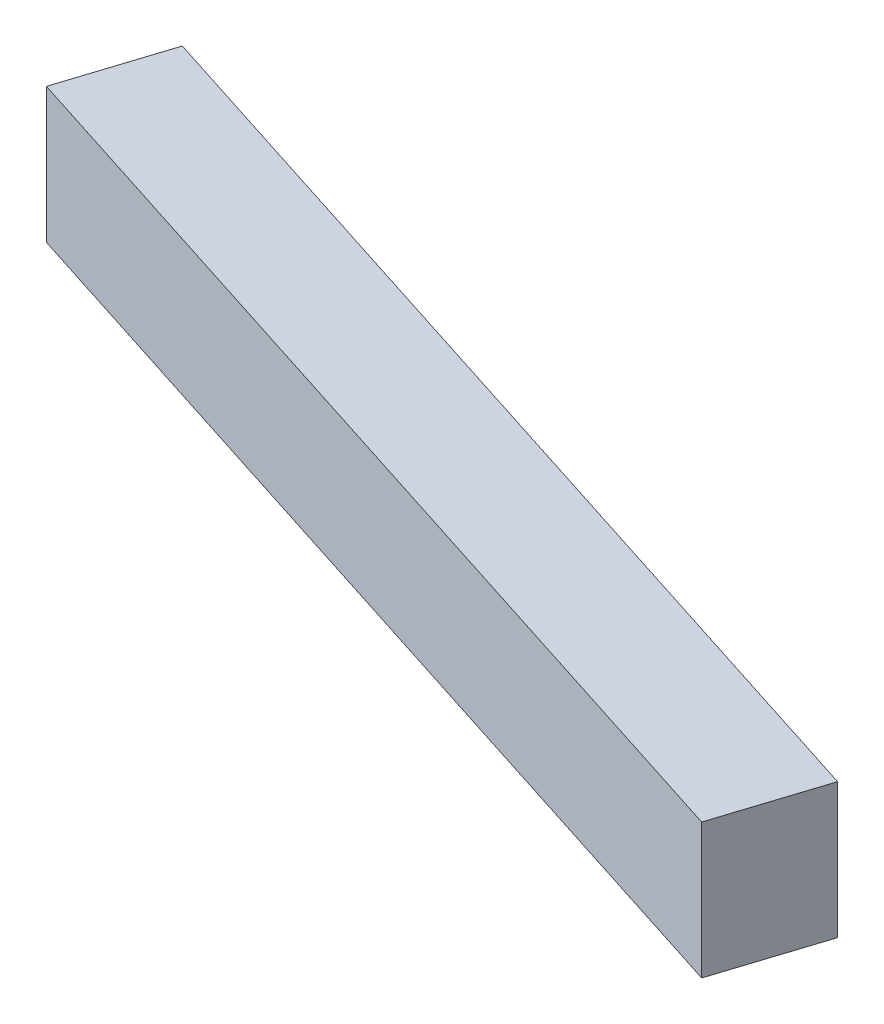
ISO-10303-21;
HEADER;
FILE_DESCRIPTION(('STEP AP214'),'2;1');
FILE_NAME('part.step','',(''),(''),'','','');
FILE_SCHEMA(('AUTOMOTIVE_DESIGN { 1 0 10303 214 1 1 1 1 }'));
ENDSEC;
DATA;
#1=APPLICATION_CONTEXT('core data for automotive mechanical design processes');
#2=APPLICATION_PROTOCOL_DEFINITION('international standard','automotive_design',2000,#1);
#3=PRODUCT_CONTEXT('',#1,'mechanical');
#4=PRODUCT('Part','Part','',(#3));
#5=PRODUCT_RELATED_PRODUCT_CATEGORY('part','',(#4));
#6=PRODUCT_DEFINITION_FORMATION('','',#4);
#7=PRODUCT_DEFINITION_CONTEXT('part definition',#1,'design');
#8=PRODUCT_DEFINITION('design','',#6,#7);
#9=PRODUCT_DEFINITION_SHAPE('','',#8);
#10=(LENGTH_UNIT() NAMED_UNIT(*) SI_UNIT(.MILLI.,.METRE.));
#11=(NAMED_UNIT(*) PLANE_ANGLE_UNIT() SI_UNIT($,.RADIAN.));
#12=(NAMED_UNIT(*) SI_UNIT($,.STERADIAN.) SOLID_ANGLE_UNIT());
#13=UNCERTAINTY_MEASURE_WITH_UNIT(LENGTH_MEASURE(1.E-05),#10,'distance_accuracy_value','');
#14=(GEOMETRIC_REPRESENTATION_CONTEXT(3) GLOBAL_UNCERTAINTY_ASSIGNED_CONTEXT((#13)) GLOBAL_UNIT_ASSIGNED_CONTEXT((#10,
#11,#12)) REPRESENTATION_CONTEXT('',''));
#15=CARTESIAN_POINT('',(0.,0.,0.));
#16=DIRECTION('',(0.,0.,1.));
#17=DIRECTION('',(1.,0.,0.));
#18=AXIS2_PLACEMENT_3D('',#15,#16,#17);
#19=CARTESIAN_POINT('',(17.168647709003,7.874,5.40152490521152));
#20=DIRECTION('',(-0.305451567320852,0.,0.952207613927359));
#21=DIRECTION('',(0.952207613927359,0.,0.305451567320852));
#22=AXIS2_PLACEMENT_3D('',#19,#20,#21);
#23=PLANE('',#22);
#24=DIRECTION('',(0.,1.,0.));
#25=VECTOR('',#24,1.);
#26=CARTESIAN_POINT('',(17.168647709003,7.874,5.40152490521152));
#27=LINE('',#26,#25);
#28=CARTESIAN_POINT('',(17.168647709003,7.62,5.40152490521152));
#29=VERTEX_POINT('',#28);
#30=CARTESIAN_POINT('',(17.168647709003,7.874,5.40152490521152));
#31=VERTEX_POINT('',#30);
#32=EDGE_CURVE('E20',#29,#31,#27,.T.);
#33=ORIENTED_EDGE('',*,*,#32,.T.);
#34=DIRECTION('',(0.952207613927359,0.,0.305451567320854));
#35=VECTOR('',#34,1.);
#36=CARTESIAN_POINT('',(17.168647709003,7.874,5.40152490521152));
#37=LINE('',#36,#35);
#38=CARTESIAN_POINT('',(18.9826032135346,7.874,5.98341014095774));
#39=VERTEX_POINT('',#38);
#40=EDGE_CURVE('E55',#31,#39,#37,.T.);
#41=ORIENTED_EDGE('',*,*,#40,.T.);
#42=DIRECTION('',(0.,1.,0.));
#43=VECTOR('',#42,1.);
#44=CARTESIAN_POINT('',(18.9826032135346,7.874,5.98341014095774));
#45=LINE('',#44,#43);
#46=CARTESIAN_POINT('',(18.9826032135346,7.62,5.98341014095774));
#47=VERTEX_POINT('',#46);
#48=EDGE_CURVE('E76',#39,#47,#45,.F.);
#49=ORIENTED_EDGE('',*,*,#48,.T.);
#50=DIRECTION('',(0.952207613927359,0.,0.305451567320854));
#51=VECTOR('',#50,1.);
#52=CARTESIAN_POINT('',(17.168647709003,7.62,5.40152490521152));
#53=LINE('',#52,#51);
#54=EDGE_CURVE('E58',#29,#47,#53,.T.);
#55=ORIENTED_EDGE('',*,*,#54,.F.);
#56=EDGE_LOOP('',(#33,#41,#49,#55));
#57=FACE_BOUND('',#56,.T.);
#58=ADVANCED_FACE('F17',(#57),#23,.F.);
#59=CARTESIAN_POINT('',(17.168647709003,7.874,5.40152490521152));
#60=DIRECTION('',(0.952207613927382,0.,0.305451567320783));
#61=DIRECTION('',(0.305451567320783,0.,-0.952207613927382));
#62=AXIS2_PLACEMENT_3D('',#59,#60,#61);
#63=PLANE('',#62);
#64=DIRECTION('',(0.,1.,0.));
#65=VECTOR('',#64,1.);
#66=CARTESIAN_POINT('',(17.1065799505234,7.874,5.59501349236157));
#67=LINE('',#66,#65);
#68=CARTESIAN_POINT('',(17.1065799505234,7.62,5.59501349236157));
#69=VERTEX_POINT('',#68);
#70=CARTESIAN_POINT('',(17.1065799505234,7.874,5.59501349236157));
#71=VERTEX_POINT('',#70);
#72=EDGE_CURVE('E73',#69,#71,#67,.T.);
#73=ORIENTED_EDGE('',*,*,#72,.T.);
#74=DIRECTION('',(0.305451567320854,0.,-0.952207613927359));
#75=VECTOR('',#74,1.);
#76=CARTESIAN_POINT('',(17.1065799505234,7.874,5.59501349236157));
#77=LINE('',#76,#75);
#78=EDGE_CURVE('E63',#71,#31,#77,.T.);
#79=ORIENTED_EDGE('',*,*,#78,.T.);
#80=ORIENTED_EDGE('',*,*,#32,.F.);
#81=DIRECTION('',(0.305451567320854,0.,-0.952207613927359));
#82=VECTOR('',#81,1.);
#83=CARTESIAN_POINT('',(17.1065799505234,7.62,5.59501349236157));
#84=LINE('',#83,#82);
#85=EDGE_CURVE('E80',#69,#29,#84,.T.);
#86=ORIENTED_EDGE('',*,*,#85,.F.);
#87=EDGE_LOOP('',(#73,#79,#80,#86));
#88=FACE_BOUND('',#87,.T.);
#89=ADVANCED_FACE('F72',(#88),#63,.F.);
#90=CARTESIAN_POINT('',(17.168647709003,7.874,5.40152490521152));
#91=DIRECTION('',(0.,-1.,0.));
#92=DIRECTION('',(0.,0.,-1.));
#93=AXIS2_PLACEMENT_3D('',#90,#91,#92);
#94=PLANE('',#93);
#95=ORIENTED_EDGE('',*,*,#78,.F.);
#96=DIRECTION('',(-0.95220761392736,0.,-0.305451567320851));
#97=VECTOR('',#96,1.);
#98=CARTESIAN_POINT('',(17.1065799505234,7.874,5.59501349236157));
#99=LINE('',#98,#97);
#100=CARTESIAN_POINT('',(18.9205354553496,7.874,6.17689872820227));
#101=VERTEX_POINT('',#100);
#102=EDGE_CURVE('E83',#71,#101,#99,.F.);
#103=ORIENTED_EDGE('',*,*,#102,.T.);
#104=DIRECTION('',(-0.305451565871283,0.,0.952207614392356));
#105=VECTOR('',#104,1.);
#106=CARTESIAN_POINT('',(18.9826032135346,7.874,5.98341014095774));
#107=LINE('',#106,#105);
#108=EDGE_CURVE('E69',#101,#39,#107,.F.);
#109=ORIENTED_EDGE('',*,*,#108,.T.);
#110=ORIENTED_EDGE('',*,*,#40,.F.);
#111=EDGE_LOOP('',(#95,#103,#109,#110));
#112=FACE_BOUND('',#111,.T.);
#113=ADVANCED_FACE('F66',(#112),#94,.F.);
#114=CARTESIAN_POINT('',(18.9826032135346,7.874,5.98341014095774));
#115=DIRECTION('',(-0.952207614392356,0.,-0.305451565871283));
#116=DIRECTION('',(-0.305451565871283,0.,0.952207614392356));
#117=AXIS2_PLACEMENT_3D('',#114,#115,#116);
#118=PLANE('',#117);
#119=ORIENTED_EDGE('',*,*,#48,.F.);
#120=ORIENTED_EDGE('',*,*,#108,.F.);
#121=DIRECTION('',(0.,1.,0.));
#122=VECTOR('',#121,1.);
#123=CARTESIAN_POINT('',(18.9205354553496,7.874,6.17689872820228));
#124=LINE('',#123,#122);
#125=CARTESIAN_POINT('',(18.9205354553496,7.62,6.17689872820227));
#126=VERTEX_POINT('',#125);
#127=EDGE_CURVE('E26',#101,#126,#124,.F.);
#128=ORIENTED_EDGE('',*,*,#127,.T.);
#129=DIRECTION('',(-0.305451565871079,0.,0.952207614392421));
#130=VECTOR('',#129,1.);
#131=CARTESIAN_POINT('',(18.9826032135346,7.62,5.98341014095774));
#132=LINE('',#131,#130);
#133=EDGE_CURVE('E34',#47,#126,#132,.T.);
#134=ORIENTED_EDGE('',*,*,#133,.F.);
#135=EDGE_LOOP('',(#119,#120,#128,#134));
#136=FACE_BOUND('',#135,.T.);
#137=ADVANCED_FACE('F88',(#136),#118,.F.);
#138=CARTESIAN_POINT('',(17.168647709003,7.62,5.40152490521152));
#139=DIRECTION('',(0.,-1.,0.));
#140=DIRECTION('',(0.,0.,-1.));
#141=AXIS2_PLACEMENT_3D('',#138,#139,#140);
#142=PLANE('',#141);
#143=DIRECTION('',(-0.95220761392736,0.,-0.305451567320851));
#144=VECTOR('',#143,1.);
#145=CARTESIAN_POINT('',(17.1065799505234,7.62,5.59501349236157));
#146=LINE('',#145,#144);
#147=EDGE_CURVE('E11',#126,#69,#146,.T.);
#148=ORIENTED_EDGE('',*,*,#147,.T.);
#149=ORIENTED_EDGE('',*,*,#85,.T.);
#150=ORIENTED_EDGE('',*,*,#54,.T.);
#151=ORIENTED_EDGE('',*,*,#133,.T.);
#152=EDGE_LOOP('',(#148,#149,#150,#151));
#153=FACE_BOUND('',#152,.T.);
#154=ADVANCED_FACE('F91',(#153),#142,.T.);
#155=CARTESIAN_POINT('',(17.1065799505234,7.874,5.59501349236157));
#156=DIRECTION('',(0.305451567320851,0.,-0.95220761392736));
#157=DIRECTION('',(-0.95220761392736,0.,-0.305451567320851));
#158=AXIS2_PLACEMENT_3D('',#155,#156,#157);
#159=PLANE('',#158);
#160=ORIENTED_EDGE('',*,*,#127,.F.);
#161=ORIENTED_EDGE('',*,*,#102,.F.);
#162=ORIENTED_EDGE('',*,*,#72,.F.);
#163=ORIENTED_EDGE('',*,*,#147,.F.);
#164=EDGE_LOOP('',(#160,#161,#162,#163));
#165=FACE_BOUND('',#164,.T.);
#166=ADVANCED_FACE('F90',(#165),#159,.F.);
#167=CLOSED_SHELL('',(#58,#89,#113,#137,#154,#166));
#168=MANIFOLD_SOLID_BREP('B1',#167);
#169=ADVANCED_BREP_SHAPE_REPRESENTATION('',(#18,#168),#14);
#170=SHAPE_DEFINITION_REPRESENTATION(#9,#169);
ENDSEC;
END-ISO-10303-21;
